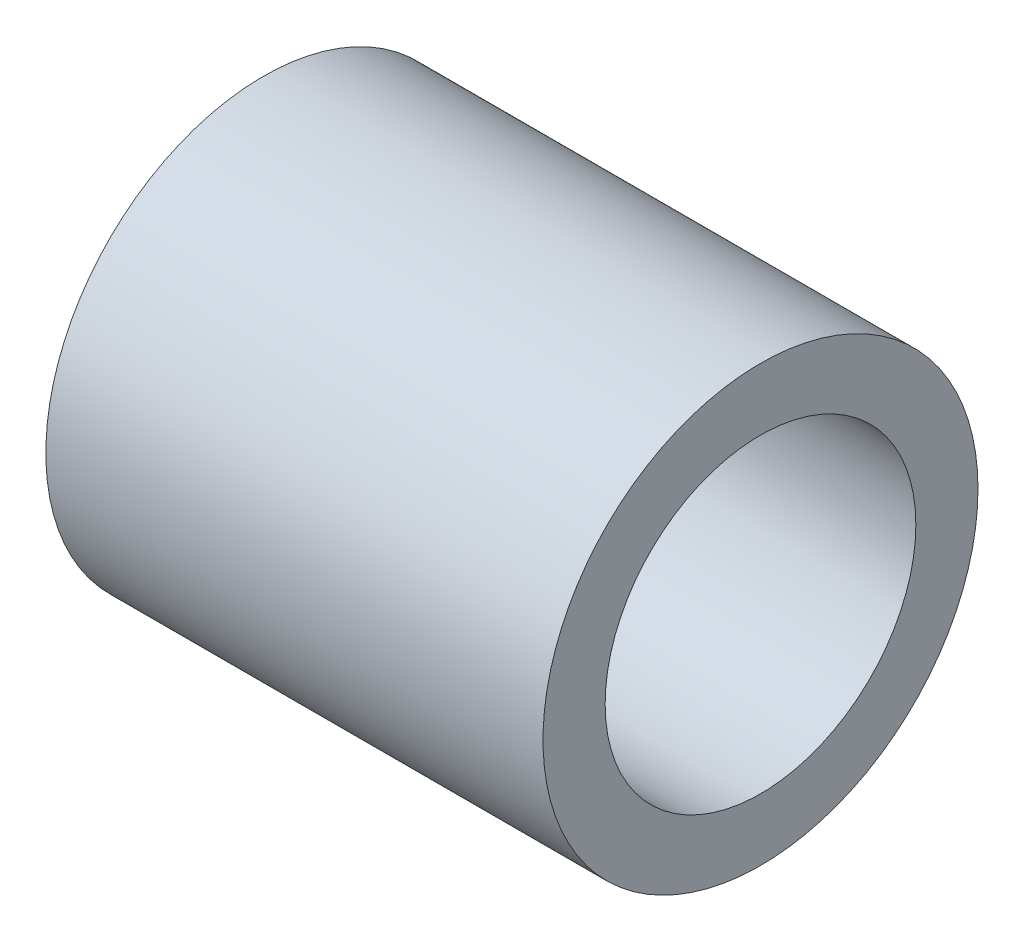
ISO-10303-21;
HEADER;
FILE_DESCRIPTION(('STEP AP214'),'2;1');
FILE_NAME('part.step','',(''),(''),'','','');
FILE_SCHEMA(('AUTOMOTIVE_DESIGN { 1 0 10303 214 1 1 1 1 }'));
ENDSEC;
DATA;
#1=APPLICATION_CONTEXT('core data for automotive mechanical design processes');
#2=APPLICATION_PROTOCOL_DEFINITION('international standard','automotive_design',2000,#1);
#3=PRODUCT_CONTEXT('',#1,'mechanical');
#4=PRODUCT('Part','Part','',(#3));
#5=PRODUCT_RELATED_PRODUCT_CATEGORY('part','',(#4));
#6=PRODUCT_DEFINITION_FORMATION('','',#4);
#7=PRODUCT_DEFINITION_CONTEXT('part definition',#1,'design');
#8=PRODUCT_DEFINITION('design','',#6,#7);
#9=PRODUCT_DEFINITION_SHAPE('','',#8);
#10=(LENGTH_UNIT() NAMED_UNIT(*) SI_UNIT(.MILLI.,.METRE.));
#11=(NAMED_UNIT(*) PLANE_ANGLE_UNIT() SI_UNIT($,.RADIAN.));
#12=(NAMED_UNIT(*) SI_UNIT($,.STERADIAN.) SOLID_ANGLE_UNIT());
#13=UNCERTAINTY_MEASURE_WITH_UNIT(LENGTH_MEASURE(1.E-05),#10,'distance_accuracy_value','');
#14=(GEOMETRIC_REPRESENTATION_CONTEXT(3) GLOBAL_UNCERTAINTY_ASSIGNED_CONTEXT((#13)) GLOBAL_UNIT_ASSIGNED_CONTEXT((#10,
#11,#12)) REPRESENTATION_CONTEXT('',''));
#15=CARTESIAN_POINT('',(0.,0.,0.));
#16=DIRECTION('',(0.,0.,1.));
#17=DIRECTION('',(1.,0.,0.));
#18=AXIS2_PLACEMENT_3D('',#15,#16,#17);
#19=CARTESIAN_POINT('',(20.,0.,0.));
#20=DIRECTION('',(1.,0.,0.));
#21=DIRECTION('',(0.,0.,-1.));
#22=AXIS2_PLACEMENT_3D('',#19,#20,#21);
#23=PLANE('',#22);
#24=CARTESIAN_POINT('',(20.,0.,0.));
#25=DIRECTION('',(1.,0.,0.));
#26=DIRECTION('',(0.,0.,-1.));
#27=AXIS2_PLACEMENT_3D('',#24,#25,#26);
#28=CIRCLE('',#27,17.5);
#29=CARTESIAN_POINT('',(20.,0.,-17.5));
#30=VERTEX_POINT('',#29);
#31=EDGE_CURVE('E10',#30,#30,#28,.T.);
#32=ORIENTED_EDGE('',*,*,#31,.T.);
#33=EDGE_LOOP('',(#32));
#34=FACE_BOUND('',#33,.T.);
#35=CARTESIAN_POINT('',(20.,0.,0.));
#36=DIRECTION('',(1.,0.,0.));
#37=DIRECTION('',(0.,0.,-1.));
#38=AXIS2_PLACEMENT_3D('',#35,#36,#37);
#39=CIRCLE('',#38,12.5);
#40=CARTESIAN_POINT('',(20.,0.,-12.5));
#41=VERTEX_POINT('',#40);
#42=EDGE_CURVE('E50',#41,#41,#39,.T.);
#43=ORIENTED_EDGE('',*,*,#42,.F.);
#44=EDGE_LOOP('',(#43));
#45=FACE_BOUND('',#44,.T.);
#46=ADVANCED_FACE('F37',(#34,#45),#23,.T.);
#47=CARTESIAN_POINT('',(-20.,0.,0.));
#48=DIRECTION('',(1.,0.,0.));
#49=DIRECTION('',(0.,0.,-1.));
#50=AXIS2_PLACEMENT_3D('',#47,#48,#49);
#51=PLANE('',#50);
#52=CARTESIAN_POINT('',(-20.,0.,0.));
#53=DIRECTION('',(1.,0.,0.));
#54=DIRECTION('',(0.,0.,-1.));
#55=AXIS2_PLACEMENT_3D('',#52,#53,#54);
#56=CIRCLE('',#55,17.5);
#57=CARTESIAN_POINT('',(-20.,0.,-17.5));
#58=VERTEX_POINT('',#57);
#59=EDGE_CURVE('E41',#58,#58,#56,.T.);
#60=ORIENTED_EDGE('',*,*,#59,.F.);
#61=EDGE_LOOP('',(#60));
#62=FACE_BOUND('',#61,.T.);
#63=CARTESIAN_POINT('',(-20.,0.,0.));
#64=DIRECTION('',(1.,0.,0.));
#65=DIRECTION('',(0.,0.,-1.));
#66=AXIS2_PLACEMENT_3D('',#63,#64,#65);
#67=CIRCLE('',#66,12.5);
#68=CARTESIAN_POINT('',(-20.,0.,-12.5));
#69=VERTEX_POINT('',#68);
#70=EDGE_CURVE('E52',#69,#69,#67,.T.);
#71=ORIENTED_EDGE('',*,*,#70,.T.);
#72=EDGE_LOOP('',(#71));
#73=FACE_BOUND('',#72,.T.);
#74=ADVANCED_FACE('F64',(#62,#73),#51,.F.);
#75=CARTESIAN_POINT('',(20.,0.,0.));
#76=DIRECTION('',(-1.,0.,0.));
#77=DIRECTION('',(0.,0.,1.));
#78=AXIS2_PLACEMENT_3D('',#75,#76,#77);
#79=CYLINDRICAL_SURFACE('',#78,17.5);
#80=ORIENTED_EDGE('',*,*,#31,.F.);
#81=EDGE_LOOP('',(#80));
#82=FACE_BOUND('',#81,.T.);
#83=ORIENTED_EDGE('',*,*,#59,.T.);
#84=EDGE_LOOP('',(#83));
#85=FACE_BOUND('',#84,.T.);
#86=ADVANCED_FACE('F39',(#82,#85),#79,.T.);
#87=CARTESIAN_POINT('',(20.,0.,0.));
#88=DIRECTION('',(-1.,0.,0.));
#89=DIRECTION('',(0.,0.,1.));
#90=AXIS2_PLACEMENT_3D('',#87,#88,#89);
#91=CYLINDRICAL_SURFACE('',#90,12.5);
#92=ORIENTED_EDGE('',*,*,#42,.T.);
#93=EDGE_LOOP('',(#92));
#94=FACE_BOUND('',#93,.T.);
#95=ORIENTED_EDGE('',*,*,#70,.F.);
#96=EDGE_LOOP('',(#95));
#97=FACE_BOUND('',#96,.T.);
#98=ADVANCED_FACE('F60',(#94,#97),#91,.F.);
#99=CLOSED_SHELL('',(#46,#74,#86,#98));
#100=MANIFOLD_SOLID_BREP('B2',#99);
#101=ADVANCED_BREP_SHAPE_REPRESENTATION('',(#18,#100),#14);
#102=SHAPE_DEFINITION_REPRESENTATION(#9,#101);
ENDSEC;
END-ISO-10303-21;
